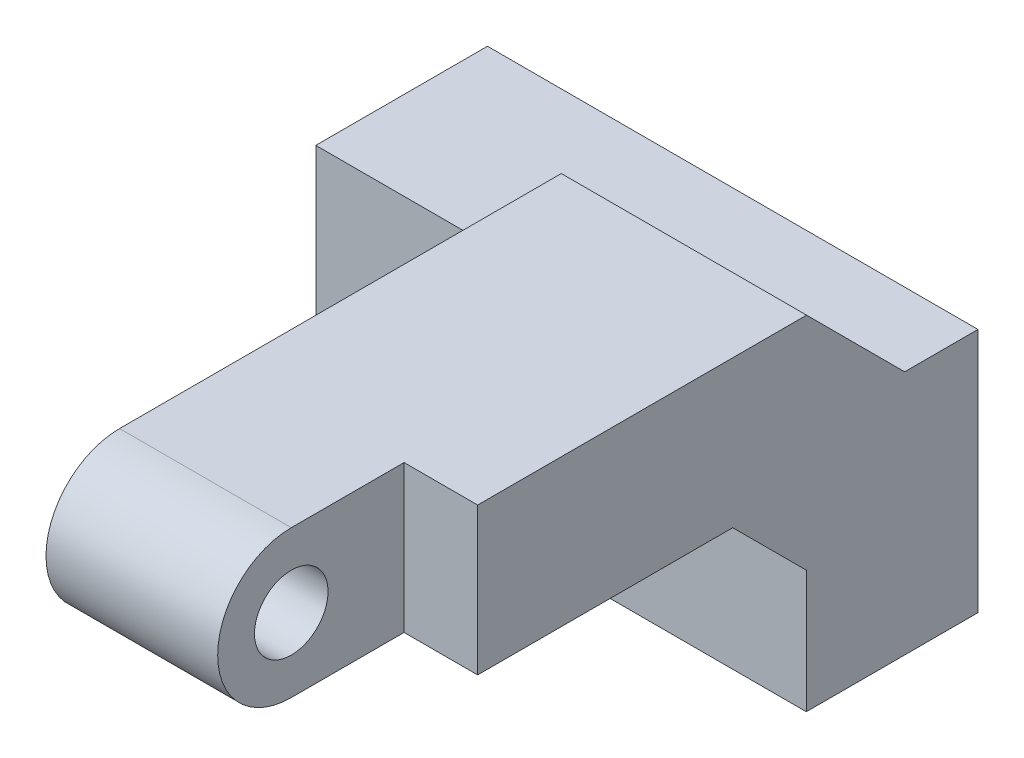
ISO-10303-21;
HEADER;
FILE_DESCRIPTION(('STEP AP214'),'2;1');
FILE_NAME('part.step','',(''),(''),'','','');
FILE_SCHEMA(('AUTOMOTIVE_DESIGN { 1 0 10303 214 1 1 1 1 }'));
ENDSEC;
DATA;
#1=APPLICATION_CONTEXT('core data for automotive mechanical design processes');
#2=APPLICATION_PROTOCOL_DEFINITION('international standard','automotive_design',2000,#1);
#3=PRODUCT_CONTEXT('',#1,'mechanical');
#4=PRODUCT('Part','Part','',(#3));
#5=PRODUCT_RELATED_PRODUCT_CATEGORY('part','',(#4));
#6=PRODUCT_DEFINITION_FORMATION('','',#4);
#7=PRODUCT_DEFINITION_CONTEXT('part definition',#1,'design');
#8=PRODUCT_DEFINITION('design','',#6,#7);
#9=PRODUCT_DEFINITION_SHAPE('','',#8);
#10=(LENGTH_UNIT() NAMED_UNIT(*) SI_UNIT(.MILLI.,.METRE.));
#11=(NAMED_UNIT(*) PLANE_ANGLE_UNIT() SI_UNIT($,.RADIAN.));
#12=(NAMED_UNIT(*) SI_UNIT($,.STERADIAN.) SOLID_ANGLE_UNIT());
#13=UNCERTAINTY_MEASURE_WITH_UNIT(LENGTH_MEASURE(1.E-05),#10,'distance_accuracy_value','');
#14=(GEOMETRIC_REPRESENTATION_CONTEXT(3) GLOBAL_UNCERTAINTY_ASSIGNED_CONTEXT((#13)) GLOBAL_UNIT_ASSIGNED_CONTEXT((#10,
#11,#12)) REPRESENTATION_CONTEXT('',''));
#15=CARTESIAN_POINT('',(0.,0.,0.));
#16=DIRECTION('',(0.,0.,1.));
#17=DIRECTION('',(1.,0.,0.));
#18=AXIS2_PLACEMENT_3D('',#15,#16,#17);
#19=CARTESIAN_POINT('',(-10.,10.,3.5));
#20=DIRECTION('',(0.,0.,-1.));
#21=DIRECTION('',(-1.,0.,0.));
#22=AXIS2_PLACEMENT_3D('',#19,#20,#21);
#23=PLANE('',#22);
#24=DIRECTION('',(-1.,0.,0.));
#25=VECTOR('',#24,1.);
#26=CARTESIAN_POINT('',(-10.,6.75,3.5));
#27=LINE('',#26,#25);
#28=CARTESIAN_POINT('',(0.,6.75,3.5));
#29=VERTEX_POINT('',#28);
#30=CARTESIAN_POINT('',(-1.58771324027147,6.75,3.5));
#31=VERTEX_POINT('',#30);
#32=EDGE_CURVE('E171',#29,#31,#27,.T.);
#33=ORIENTED_EDGE('',*,*,#32,.F.);
#34=DIRECTION('',(0.,1.,0.));
#35=VECTOR('',#34,1.);
#36=CARTESIAN_POINT('',(0.,5.,3.5));
#37=LINE('',#36,#35);
#38=CARTESIAN_POINT('',(0.,10.,3.5));
#39=VERTEX_POINT('',#38);
#40=EDGE_CURVE('E245',#29,#39,#37,.T.);
#41=ORIENTED_EDGE('',*,*,#40,.T.);
#42=DIRECTION('',(1.,0.,0.));
#43=VECTOR('',#42,1.);
#44=CARTESIAN_POINT('',(-10.,10.,3.5));
#45=LINE('',#44,#43);
#46=CARTESIAN_POINT('',(-10.,10.,3.5));
#47=VERTEX_POINT('',#46);
#48=EDGE_CURVE('E277',#47,#39,#45,.T.);
#49=ORIENTED_EDGE('',*,*,#48,.F.);
#50=DIRECTION('',(0.,-1.,0.));
#51=VECTOR('',#50,1.);
#52=CARTESIAN_POINT('',(-10.,10.,3.5));
#53=LINE('',#52,#51);
#54=CARTESIAN_POINT('',(-10.,0.,3.5));
#55=VERTEX_POINT('',#54);
#56=EDGE_CURVE('E301',#47,#55,#53,.T.);
#57=ORIENTED_EDGE('',*,*,#56,.T.);
#58=DIRECTION('',(1.,0.,0.));
#59=VECTOR('',#58,1.);
#60=CARTESIAN_POINT('',(-10.,0.,3.5));
#61=LINE('',#60,#59);
#62=CARTESIAN_POINT('',(10.,0.,3.5));
#63=VERTEX_POINT('',#62);
#64=EDGE_CURVE('E288',#55,#63,#61,.T.);
#65=ORIENTED_EDGE('',*,*,#64,.T.);
#66=DIRECTION('',(0.,-1.,0.));
#67=VECTOR('',#66,1.);
#68=CARTESIAN_POINT('',(10.,10.,3.5));
#69=LINE('',#68,#67);
#70=CARTESIAN_POINT('',(10.,5.,3.5));
#71=VERTEX_POINT('',#70);
#72=EDGE_CURVE('E299',#71,#63,#69,.T.);
#73=ORIENTED_EDGE('',*,*,#72,.F.);
#74=DIRECTION('',(-1.,0.,0.));
#75=VECTOR('',#74,1.);
#76=CARTESIAN_POINT('',(10.,5.,3.5));
#77=LINE('',#76,#75);
#78=CARTESIAN_POINT('',(2.59807621135331,5.,3.5));
#79=VERTEX_POINT('',#78);
#80=EDGE_CURVE('E270',#71,#79,#77,.T.);
#81=ORIENTED_EDGE('',*,*,#80,.T.);
#82=DIRECTION('',(-0.5,0.866025403784438,0.));
#83=VECTOR('',#82,1.);
#84=CARTESIAN_POINT('',(-2.71650635094611,14.2051270189222,3.5));
#85=LINE('',#84,#83);
#86=CARTESIAN_POINT('',(3.17542648054294,4.,3.5));
#87=VERTEX_POINT('',#86);
#88=EDGE_CURVE('E211',#87,#79,#85,.T.);
#89=ORIENTED_EDGE('',*,*,#88,.F.);
#90=DIRECTION('',(0.5,0.866025403784439,0.));
#91=VECTOR('',#90,1.);
#92=CARTESIAN_POINT('',(2.47964607176052,2.7948729810778,3.5));
#93=LINE('',#92,#91);
#94=CARTESIAN_POINT('',(1.58771324027147,1.25,3.5));
#95=VERTEX_POINT('',#94);
#96=EDGE_CURVE('E318',#95,#87,#93,.T.);
#97=ORIENTED_EDGE('',*,*,#96,.F.);
#98=DIRECTION('',(1.,0.,0.));
#99=VECTOR('',#98,1.);
#100=CARTESIAN_POINT('',(-10.,1.25,3.5));
#101=LINE('',#100,#99);
#102=CARTESIAN_POINT('',(-1.58771324027147,1.25,3.5));
#103=VERTEX_POINT('',#102);
#104=EDGE_CURVE('E320',#103,#95,#101,.T.);
#105=ORIENTED_EDGE('',*,*,#104,.F.);
#106=DIRECTION('',(0.5,-0.866025403784438,0.));
#107=VECTOR('',#106,1.);
#108=CARTESIAN_POINT('',(-7.47964607176053,11.4551270189222,3.5));
#109=LINE('',#108,#107);
#110=CARTESIAN_POINT('',(-3.17542648054294,4.,3.5));
#111=VERTEX_POINT('',#110);
#112=EDGE_CURVE('E42',#111,#103,#109,.T.);
#113=ORIENTED_EDGE('',*,*,#112,.F.);
#114=DIRECTION('',(-0.5,-0.866025403784439,0.));
#115=VECTOR('',#114,1.);
#116=CARTESIAN_POINT('',(-2.28349364905389,5.54487298107781,3.5));
#117=LINE('',#116,#115);
#118=EDGE_CURVE('E11',#31,#111,#117,.T.);
#119=ORIENTED_EDGE('',*,*,#118,.F.);
#120=EDGE_LOOP('',(#33,#41,#49,#57,#65,#73,#81,#89,#97,#105,#113,#119));
#121=FACE_BOUND('',#120,.T.);
#122=ADVANCED_FACE('F34',(#121),#23,.F.);
#123=CARTESIAN_POINT('',(10.,8.,6.50000000000004));
#124=DIRECTION('',(0.,0.707106781186551,-0.707106781186544));
#125=DIRECTION('',(0.,0.707106781186544,0.707106781186551));
#126=AXIS2_PLACEMENT_3D('',#123,#124,#125);
#127=PLANE('',#126);
#128=DIRECTION('',(-1.,0.,0.));
#129=VECTOR('',#128,1.);
#130=CARTESIAN_POINT('',(10.,6.75,5.25000000000002));
#131=LINE('',#130,#129);
#132=CARTESIAN_POINT('',(1.58771324027147,6.75,5.25000000000002));
#133=VERTEX_POINT('',#132);
#134=CARTESIAN_POINT('',(0.,6.75,5.25000000000002));
#135=VERTEX_POINT('',#134);
#136=EDGE_CURVE('E49',#133,#135,#131,.T.);
#137=ORIENTED_EDGE('',*,*,#136,.F.);
#138=DIRECTION('',(-0.377964473009226,0.654653670707974,0.654653670707981));
#139=VECTOR('',#138,1.);
#140=CARTESIAN_POINT('',(2.1708789175295,5.73992741775877,4.23992741775878));
#141=LINE('',#140,#139);
#142=EDGE_CURVE('E316',#79,#133,#141,.T.);
#143=ORIENTED_EDGE('',*,*,#142,.F.);
#144=ORIENTED_EDGE('',*,*,#80,.F.);
#145=DIRECTION('',(0.,-0.707106781186544,-0.707106781186551));
#146=VECTOR('',#145,1.);
#147=CARTESIAN_POINT('',(10.,8.,6.50000000000004));
#148=LINE('',#147,#146);
#149=CARTESIAN_POINT('',(10.,8.,6.50000000000004));
#150=VERTEX_POINT('',#149);
#151=EDGE_CURVE('E231',#150,#71,#148,.T.);
#152=ORIENTED_EDGE('',*,*,#151,.F.);
#153=DIRECTION('',(-1.,0.,0.));
#154=VECTOR('',#153,1.);
#155=CARTESIAN_POINT('',(10.,8.,6.50000000000004));
#156=LINE('',#155,#154);
#157=CARTESIAN_POINT('',(0.,8.,6.50000000000004));
#158=VERTEX_POINT('',#157);
#159=EDGE_CURVE('E242',#150,#158,#156,.T.);
#160=ORIENTED_EDGE('',*,*,#159,.T.);
#161=DIRECTION('',(0.,-0.707106781186544,-0.707106781186551));
#162=VECTOR('',#161,1.);
#163=CARTESIAN_POINT('',(0.,8.,6.50000000000004));
#164=LINE('',#163,#162);
#165=EDGE_CURVE('E230',#158,#135,#164,.T.);
#166=ORIENTED_EDGE('',*,*,#165,.T.);
#167=EDGE_LOOP('',(#137,#143,#144,#152,#160,#166));
#168=FACE_BOUND('',#167,.T.);
#169=ADVANCED_FACE('F341',(#168),#127,.F.);
#170=CARTESIAN_POINT('',(0.,11.,21.5));
#171=DIRECTION('',(1.,0.,0.));
#172=DIRECTION('',(0.,0.,-1.));
#173=AXIS2_PLACEMENT_3D('',#170,#171,#172);
#174=PLANE('',#173);
#175=CARTESIAN_POINT('',(0.,11.,21.5));
#176=DIRECTION('',(-1.,0.,0.));
#177=DIRECTION('',(0.,0.,1.));
#178=AXIS2_PLACEMENT_3D('',#175,#176,#177);
#179=CIRCLE('',#178,1.5);
#180=CARTESIAN_POINT('',(0.,11.,23.));
#181=VERTEX_POINT('',#180);
#182=EDGE_CURVE('E216',#181,#181,#179,.T.);
#183=ORIENTED_EDGE('',*,*,#182,.F.);
#184=EDGE_LOOP('',(#183));
#185=FACE_BOUND('',#184,.T.);
#186=DIRECTION('',(0.,0.,-1.));
#187=VECTOR('',#186,1.);
#188=CARTESIAN_POINT('',(0.,6.75,21.5));
#189=LINE('',#188,#187);
#190=EDGE_CURVE('E310',#135,#29,#189,.T.);
#191=ORIENTED_EDGE('',*,*,#190,.F.);
#192=ORIENTED_EDGE('',*,*,#165,.F.);
#193=DIRECTION('',(0.,0.,-1.));
#194=VECTOR('',#193,1.);
#195=CARTESIAN_POINT('',(0.,8.,6.50000000000004));
#196=LINE('',#195,#194);
#197=CARTESIAN_POINT('',(0.,8.,21.5));
#198=VERTEX_POINT('',#197);
#199=EDGE_CURVE('E235',#198,#158,#196,.T.);
#200=ORIENTED_EDGE('',*,*,#199,.F.);
#201=CARTESIAN_POINT('',(0.,11.,21.5));
#202=DIRECTION('',(1.,0.,0.));
#203=DIRECTION('',(0.,0.,-1.));
#204=AXIS2_PLACEMENT_3D('',#201,#202,#203);
#205=CIRCLE('',#204,3.);
#206=CARTESIAN_POINT('',(0.,14.,21.5));
#207=VERTEX_POINT('',#206);
#208=EDGE_CURVE('E254',#207,#198,#205,.T.);
#209=ORIENTED_EDGE('',*,*,#208,.F.);
#210=DIRECTION('',(0.,0.,1.));
#211=VECTOR('',#210,1.);
#212=CARTESIAN_POINT('',(0.,14.,21.5));
#213=LINE('',#212,#211);
#214=CARTESIAN_POINT('',(0.,14.,3.48969735514617));
#215=VERTEX_POINT('',#214);
#216=EDGE_CURVE('E251',#215,#207,#213,.T.);
#217=ORIENTED_EDGE('',*,*,#216,.F.);
#218=DIRECTION('',(0.,0.707106781186544,0.707106781186551));
#219=VECTOR('',#218,1.);
#220=CARTESIAN_POINT('',(0.,10.,-0.510302644853876));
#221=LINE('',#220,#219);
#222=CARTESIAN_POINT('',(0.,10.,-0.510302644853876));
#223=VERTEX_POINT('',#222);
#224=EDGE_CURVE('E249',#223,#215,#221,.T.);
#225=ORIENTED_EDGE('',*,*,#224,.F.);
#226=DIRECTION('',(0.,0.,-1.));
#227=VECTOR('',#226,1.);
#228=CARTESIAN_POINT('',(0.,10.,3.5));
#229=LINE('',#228,#227);
#230=EDGE_CURVE('E247',#39,#223,#229,.T.);
#231=ORIENTED_EDGE('',*,*,#230,.F.);
#232=ORIENTED_EDGE('',*,*,#40,.F.);
#233=EDGE_LOOP('',(#191,#192,#200,#209,#217,#225,#231,#232));
#234=FACE_BOUND('',#233,.T.);
#235=ADVANCED_FACE('F348',(#185,#234),#174,.F.);
#236=CARTESIAN_POINT('',(0.,4.,-3.5));
#237=DIRECTION('',(0.,0.,1.));
#238=DIRECTION('',(1.,0.,0.));
#239=AXIS2_PLACEMENT_3D('',#236,#237,#238);
#240=CYLINDRICAL_SURFACE('',#239,1.5);
#241=CARTESIAN_POINT('',(0.,4.,-3.5));
#242=DIRECTION('',(0.,0.,1.));
#243=DIRECTION('',(1.,0.,0.));
#244=AXIS2_PLACEMENT_3D('',#241,#242,#243);
#245=CIRCLE('',#244,1.5);
#246=CARTESIAN_POINT('',(1.5,4.,-3.5));
#247=VERTEX_POINT('',#246);
#248=EDGE_CURVE('E213',#247,#247,#245,.T.);
#249=ORIENTED_EDGE('',*,*,#248,.F.);
#250=EDGE_LOOP('',(#249));
#251=FACE_BOUND('',#250,.T.);
#252=CARTESIAN_POINT('',(0.,4.,0.));
#253=DIRECTION('',(0.,0.,1.));
#254=DIRECTION('',(1.,0.,0.));
#255=AXIS2_PLACEMENT_3D('',#252,#253,#254);
#256=CIRCLE('',#255,1.5);
#257=CARTESIAN_POINT('',(1.5,4.,0.));
#258=VERTEX_POINT('',#257);
#259=EDGE_CURVE('E174',#258,#258,#256,.F.);
#260=ORIENTED_EDGE('',*,*,#259,.F.);
#261=EDGE_LOOP('',(#260));
#262=FACE_BOUND('',#261,.T.);
#263=ADVANCED_FACE('F418',(#251,#262),#240,.F.);
#264=CARTESIAN_POINT('',(0.,10.,0.));
#265=DIRECTION('',(0.,-1.,0.));
#266=DIRECTION('',(0.,0.,-1.));
#267=AXIS2_PLACEMENT_3D('',#264,#265,#266);
#268=PLANE('',#267);
#269=DIRECTION('',(-1.,0.,0.));
#270=VECTOR('',#269,1.);
#271=CARTESIAN_POINT('',(10.,10.,-0.510302644853876));
#272=LINE('',#271,#270);
#273=CARTESIAN_POINT('',(10.,10.,-0.510302644853875));
#274=VERTEX_POINT('',#273);
#275=EDGE_CURVE('E267',#274,#223,#272,.T.);
#276=ORIENTED_EDGE('',*,*,#275,.F.);
#277=DIRECTION('',(0.,0.,-1.));
#278=VECTOR('',#277,1.);
#279=CARTESIAN_POINT('',(10.,10.,3.5));
#280=LINE('',#279,#278);
#281=CARTESIAN_POINT('',(10.,10.,-3.5));
#282=VERTEX_POINT('',#281);
#283=EDGE_CURVE('E281',#274,#282,#280,.T.);
#284=ORIENTED_EDGE('',*,*,#283,.T.);
#285=DIRECTION('',(-1.,0.,0.));
#286=VECTOR('',#285,1.);
#287=CARTESIAN_POINT('',(-10.,10.,-3.5));
#288=LINE('',#287,#286);
#289=CARTESIAN_POINT('',(-10.,10.,-3.5));
#290=VERTEX_POINT('',#289);
#291=EDGE_CURVE('E283',#282,#290,#288,.T.);
#292=ORIENTED_EDGE('',*,*,#291,.T.);
#293=DIRECTION('',(0.,0.,1.));
#294=VECTOR('',#293,1.);
#295=CARTESIAN_POINT('',(-10.,10.,3.5));
#296=LINE('',#295,#294);
#297=EDGE_CURVE('E274',#290,#47,#296,.T.);
#298=ORIENTED_EDGE('',*,*,#297,.T.);
#299=ORIENTED_EDGE('',*,*,#48,.T.);
#300=ORIENTED_EDGE('',*,*,#230,.T.);
#301=EDGE_LOOP('',(#276,#284,#292,#298,#299,#300));
#302=FACE_BOUND('',#301,.T.);
#303=ADVANCED_FACE('F353',(#302),#268,.F.);
#304=CARTESIAN_POINT('',(-10.,10.,3.5));
#305=DIRECTION('',(1.,0.,0.));
#306=DIRECTION('',(0.,0.,-1.));
#307=AXIS2_PLACEMENT_3D('',#304,#305,#306);
#308=PLANE('',#307);
#309=DIRECTION('',(0.,0.,1.));
#310=VECTOR('',#309,1.);
#311=CARTESIAN_POINT('',(-10.,0.,3.5));
#312=LINE('',#311,#310);
#313=CARTESIAN_POINT('',(-10.,0.,-3.5));
#314=VERTEX_POINT('',#313);
#315=EDGE_CURVE('E273',#314,#55,#312,.T.);
#316=ORIENTED_EDGE('',*,*,#315,.T.);
#317=ORIENTED_EDGE('',*,*,#56,.F.);
#318=ORIENTED_EDGE('',*,*,#297,.F.);
#319=DIRECTION('',(0.,-1.,0.));
#320=VECTOR('',#319,1.);
#321=CARTESIAN_POINT('',(-10.,10.,-3.5));
#322=LINE('',#321,#320);
#323=EDGE_CURVE('E285',#290,#314,#322,.T.);
#324=ORIENTED_EDGE('',*,*,#323,.T.);
#325=EDGE_LOOP('',(#316,#317,#318,#324));
#326=FACE_BOUND('',#325,.T.);
#327=ADVANCED_FACE('F36',(#326),#308,.F.);
#328=CARTESIAN_POINT('',(10.,10.,3.5));
#329=DIRECTION('',(-1.,0.,0.));
#330=DIRECTION('',(0.,0.,1.));
#331=AXIS2_PLACEMENT_3D('',#328,#329,#330);
#332=PLANE('',#331);
#333=DIRECTION('',(0.,0.,1.));
#334=VECTOR('',#333,1.);
#335=CARTESIAN_POINT('',(10.,14.,21.5));
#336=LINE('',#335,#334);
#337=CARTESIAN_POINT('',(10.,14.,3.48969735514617));
#338=VERTEX_POINT('',#337);
#339=CARTESIAN_POINT('',(10.,14.,16.9));
#340=VERTEX_POINT('',#339);
#341=EDGE_CURVE('E237',#338,#340,#336,.T.);
#342=ORIENTED_EDGE('',*,*,#341,.T.);
#343=DIRECTION('',(0.,1.,0.));
#344=VECTOR('',#343,1.);
#345=CARTESIAN_POINT('',(10.,0.,16.9));
#346=LINE('',#345,#344);
#347=CARTESIAN_POINT('',(10.,8.,16.9));
#348=VERTEX_POINT('',#347);
#349=EDGE_CURVE('E224',#348,#340,#346,.T.);
#350=ORIENTED_EDGE('',*,*,#349,.F.);
#351=DIRECTION('',(0.,0.,-1.));
#352=VECTOR('',#351,1.);
#353=CARTESIAN_POINT('',(10.,8.,6.50000000000004));
#354=LINE('',#353,#352);
#355=EDGE_CURVE('E240',#348,#150,#354,.T.);
#356=ORIENTED_EDGE('',*,*,#355,.T.);
#357=ORIENTED_EDGE('',*,*,#151,.T.);
#358=ORIENTED_EDGE('',*,*,#72,.T.);
#359=DIRECTION('',(0.,0.,-1.));
#360=VECTOR('',#359,1.);
#361=CARTESIAN_POINT('',(10.,0.,3.5));
#362=LINE('',#361,#360);
#363=CARTESIAN_POINT('',(10.,0.,-3.5));
#364=VERTEX_POINT('',#363);
#365=EDGE_CURVE('E291',#63,#364,#362,.T.);
#366=ORIENTED_EDGE('',*,*,#365,.T.);
#367=DIRECTION('',(0.,-1.,0.));
#368=VECTOR('',#367,1.);
#369=CARTESIAN_POINT('',(10.,10.,-3.5));
#370=LINE('',#369,#368);
#371=EDGE_CURVE('E296',#282,#364,#370,.T.);
#372=ORIENTED_EDGE('',*,*,#371,.F.);
#373=ORIENTED_EDGE('',*,*,#283,.F.);
#374=DIRECTION('',(0.,0.707106781186544,0.707106781186551));
#375=VECTOR('',#374,1.);
#376=CARTESIAN_POINT('',(10.,10.,-0.510302644853876));
#377=LINE('',#376,#375);
#378=EDGE_CURVE('E234',#274,#338,#377,.T.);
#379=ORIENTED_EDGE('',*,*,#378,.T.);
#380=EDGE_LOOP('',(#342,#350,#356,#357,#358,#366,#372,#373,#379));
#381=FACE_BOUND('',#380,.T.);
#382=ADVANCED_FACE('F370',(#381),#332,.F.);
#383=CARTESIAN_POINT('',(-10.,10.,-3.5));
#384=DIRECTION('',(0.,0.,1.));
#385=DIRECTION('',(1.,0.,0.));
#386=AXIS2_PLACEMENT_3D('',#383,#384,#385);
#387=PLANE('',#386);
#388=ORIENTED_EDGE('',*,*,#248,.T.);
#389=EDGE_LOOP('',(#388));
#390=FACE_BOUND('',#389,.T.);
#391=DIRECTION('',(-1.,0.,0.));
#392=VECTOR('',#391,1.);
#393=CARTESIAN_POINT('',(-10.,0.,-3.5));
#394=LINE('',#393,#392);
#395=EDGE_CURVE('E278',#364,#314,#394,.T.);
#396=ORIENTED_EDGE('',*,*,#395,.T.);
#397=ORIENTED_EDGE('',*,*,#323,.F.);
#398=ORIENTED_EDGE('',*,*,#291,.F.);
#399=ORIENTED_EDGE('',*,*,#371,.T.);
#400=EDGE_LOOP('',(#396,#397,#398,#399));
#401=FACE_BOUND('',#400,.T.);
#402=ADVANCED_FACE('F377',(#390,#401),#387,.F.);
#403=CARTESIAN_POINT('',(0.,0.,0.));
#404=DIRECTION('',(0.,-1.,0.));
#405=DIRECTION('',(0.,0.,-1.));
#406=AXIS2_PLACEMENT_3D('',#403,#404,#405);
#407=PLANE('',#406);
#408=ORIENTED_EDGE('',*,*,#315,.F.);
#409=ORIENTED_EDGE('',*,*,#395,.F.);
#410=ORIENTED_EDGE('',*,*,#365,.F.);
#411=ORIENTED_EDGE('',*,*,#64,.F.);
#412=EDGE_LOOP('',(#408,#409,#410,#411));
#413=FACE_BOUND('',#412,.T.);
#414=ADVANCED_FACE('F383',(#413),#407,.T.);
#415=CARTESIAN_POINT('',(10.,10.,-0.510302644853876));
#416=DIRECTION('',(0.,-0.707106781186551,0.707106781186544));
#417=DIRECTION('',(0.,-0.707106781186544,-0.707106781186551));
#418=AXIS2_PLACEMENT_3D('',#415,#416,#417);
#419=PLANE('',#418);
#420=ORIENTED_EDGE('',*,*,#224,.T.);
#421=DIRECTION('',(-1.,0.,0.));
#422=VECTOR('',#421,1.);
#423=CARTESIAN_POINT('',(10.,14.,3.48969735514617));
#424=LINE('',#423,#422);
#425=EDGE_CURVE('E264',#338,#215,#424,.T.);
#426=ORIENTED_EDGE('',*,*,#425,.F.);
#427=ORIENTED_EDGE('',*,*,#378,.F.);
#428=ORIENTED_EDGE('',*,*,#275,.T.);
#429=EDGE_LOOP('',(#420,#426,#427,#428));
#430=FACE_BOUND('',#429,.T.);
#431=ADVANCED_FACE('F360',(#430),#419,.F.);
#432=CARTESIAN_POINT('',(10.,14.,21.5));
#433=DIRECTION('',(0.,-1.,0.));
#434=DIRECTION('',(0.,0.,-1.));
#435=AXIS2_PLACEMENT_3D('',#432,#433,#434);
#436=PLANE('',#435);
#437=DIRECTION('',(-1.,0.,0.));
#438=VECTOR('',#437,1.);
#439=CARTESIAN_POINT('',(10.,14.,21.5));
#440=LINE('',#439,#438);
#441=CARTESIAN_POINT('',(7.,14.,21.5));
#442=VERTEX_POINT('',#441);
#443=EDGE_CURVE('E262',#442,#207,#440,.T.);
#444=ORIENTED_EDGE('',*,*,#443,.F.);
#445=DIRECTION('',(0.,0.,1.));
#446=VECTOR('',#445,1.);
#447=CARTESIAN_POINT('',(7.,14.,26.1));
#448=LINE('',#447,#446);
#449=CARTESIAN_POINT('',(7.,14.,16.9));
#450=VERTEX_POINT('',#449);
#451=EDGE_CURVE('E222',#450,#442,#448,.T.);
#452=ORIENTED_EDGE('',*,*,#451,.F.);
#453=DIRECTION('',(-1.,0.,0.));
#454=VECTOR('',#453,1.);
#455=CARTESIAN_POINT('',(10.,14.,16.9));
#456=LINE('',#455,#454);
#457=EDGE_CURVE('E220',#340,#450,#456,.T.);
#458=ORIENTED_EDGE('',*,*,#457,.F.);
#459=ORIENTED_EDGE('',*,*,#341,.F.);
#460=ORIENTED_EDGE('',*,*,#425,.T.);
#461=ORIENTED_EDGE('',*,*,#216,.T.);
#462=EDGE_LOOP('',(#444,#452,#458,#459,#460,#461));
#463=FACE_BOUND('',#462,.T.);
#464=ADVANCED_FACE('F365',(#463),#436,.F.);
#465=CARTESIAN_POINT('',(10.,11.,21.5));
#466=DIRECTION('',(-1.,0.,0.));
#467=DIRECTION('',(0.,0.,1.));
#468=AXIS2_PLACEMENT_3D('',#465,#466,#467);
#469=CYLINDRICAL_SURFACE('',#468,3.);
#470=DIRECTION('',(-1.,0.,0.));
#471=VECTOR('',#470,1.);
#472=CARTESIAN_POINT('',(10.,8.,21.5));
#473=LINE('',#472,#471);
#474=CARTESIAN_POINT('',(7.,8.,21.5));
#475=VERTEX_POINT('',#474);
#476=EDGE_CURVE('E260',#475,#198,#473,.T.);
#477=ORIENTED_EDGE('',*,*,#476,.F.);
#478=CARTESIAN_POINT('',(7.,11.,21.5));
#479=DIRECTION('',(-1.,0.,0.));
#480=DIRECTION('',(0.,0.,1.));
#481=AXIS2_PLACEMENT_3D('',#478,#479,#480);
#482=CIRCLE('',#481,3.);
#483=EDGE_CURVE('E226',#475,#442,#482,.T.);
#484=ORIENTED_EDGE('',*,*,#483,.T.);
#485=ORIENTED_EDGE('',*,*,#443,.T.);
#486=ORIENTED_EDGE('',*,*,#208,.T.);
#487=EDGE_LOOP('',(#477,#484,#485,#486));
#488=FACE_BOUND('',#487,.T.);
#489=ADVANCED_FACE('F388',(#488),#469,.T.);
#490=CARTESIAN_POINT('',(10.,8.,6.50000000000004));
#491=DIRECTION('',(0.,1.,0.));
#492=DIRECTION('',(0.,0.,1.));
#493=AXIS2_PLACEMENT_3D('',#490,#491,#492);
#494=PLANE('',#493);
#495=DIRECTION('',(-1.,0.,0.));
#496=VECTOR('',#495,1.);
#497=CARTESIAN_POINT('',(10.,8.,16.9));
#498=LINE('',#497,#496);
#499=CARTESIAN_POINT('',(7.,8.,16.9));
#500=VERTEX_POINT('',#499);
#501=EDGE_CURVE('E304',#348,#500,#498,.T.);
#502=ORIENTED_EDGE('',*,*,#501,.T.);
#503=DIRECTION('',(0.,0.,1.));
#504=VECTOR('',#503,1.);
#505=CARTESIAN_POINT('',(7.,8.,6.50000000000004));
#506=LINE('',#505,#504);
#507=EDGE_CURVE('E307',#500,#475,#506,.T.);
#508=ORIENTED_EDGE('',*,*,#507,.T.);
#509=ORIENTED_EDGE('',*,*,#476,.T.);
#510=ORIENTED_EDGE('',*,*,#199,.T.);
#511=ORIENTED_EDGE('',*,*,#159,.F.);
#512=ORIENTED_EDGE('',*,*,#355,.F.);
#513=EDGE_LOOP('',(#502,#508,#509,#510,#511,#512));
#514=FACE_BOUND('',#513,.T.);
#515=ADVANCED_FACE('F385',(#514),#494,.F.);
#516=CARTESIAN_POINT('',(7.,0.,26.1));
#517=DIRECTION('',(-1.,0.,0.));
#518=DIRECTION('',(0.,0.,1.));
#519=AXIS2_PLACEMENT_3D('',#516,#517,#518);
#520=PLANE('',#519);
#521=CARTESIAN_POINT('',(7.,11.,21.5));
#522=DIRECTION('',(-1.,0.,0.));
#523=DIRECTION('',(0.,0.,1.));
#524=AXIS2_PLACEMENT_3D('',#521,#522,#523);
#525=CIRCLE('',#524,1.5);
#526=CARTESIAN_POINT('',(7.,11.,23.));
#527=VERTEX_POINT('',#526);
#528=EDGE_CURVE('E219',#527,#527,#525,.T.);
#529=ORIENTED_EDGE('',*,*,#528,.T.);
#530=EDGE_LOOP('',(#529));
#531=FACE_BOUND('',#530,.T.);
#532=ORIENTED_EDGE('',*,*,#507,.F.);
#533=DIRECTION('',(0.,1.,0.));
#534=VECTOR('',#533,1.);
#535=CARTESIAN_POINT('',(7.,0.,16.9));
#536=LINE('',#535,#534);
#537=EDGE_CURVE('E57',#500,#450,#536,.T.);
#538=ORIENTED_EDGE('',*,*,#537,.T.);
#539=ORIENTED_EDGE('',*,*,#451,.T.);
#540=ORIENTED_EDGE('',*,*,#483,.F.);
#541=EDGE_LOOP('',(#532,#538,#539,#540));
#542=FACE_BOUND('',#541,.T.);
#543=ADVANCED_FACE('F390',(#531,#542),#520,.F.);
#544=CARTESIAN_POINT('',(10.,0.,16.9));
#545=DIRECTION('',(0.,0.,-1.));
#546=DIRECTION('',(-1.,0.,0.));
#547=AXIS2_PLACEMENT_3D('',#544,#545,#546);
#548=PLANE('',#547);
#549=ORIENTED_EDGE('',*,*,#349,.T.);
#550=ORIENTED_EDGE('',*,*,#457,.T.);
#551=ORIENTED_EDGE('',*,*,#537,.F.);
#552=ORIENTED_EDGE('',*,*,#501,.F.);
#553=EDGE_LOOP('',(#549,#550,#551,#552));
#554=FACE_BOUND('',#553,.T.);
#555=ADVANCED_FACE('F391',(#554),#548,.F.);
#556=CARTESIAN_POINT('',(10.,11.,21.5));
#557=DIRECTION('',(-1.,0.,0.));
#558=DIRECTION('',(0.,0.,1.));
#559=AXIS2_PLACEMENT_3D('',#556,#557,#558);
#560=CYLINDRICAL_SURFACE('',#559,1.5);
#561=ORIENTED_EDGE('',*,*,#182,.T.);
#562=EDGE_LOOP('',(#561));
#563=FACE_BOUND('',#562,.T.);
#564=ORIENTED_EDGE('',*,*,#528,.F.);
#565=EDGE_LOOP('',(#564));
#566=FACE_BOUND('',#565,.T.);
#567=ADVANCED_FACE('F393',(#563,#566),#560,.F.);
#568=CARTESIAN_POINT('',(-1.58771324027147,6.75,24.5));
#569=DIRECTION('',(0.866025403784439,-0.5,0.));
#570=DIRECTION('',(0.5,0.866025403784439,0.));
#571=AXIS2_PLACEMENT_3D('',#568,#569,#570);
#572=PLANE('',#571);
#573=ORIENTED_EDGE('',*,*,#118,.T.);
#574=DIRECTION('',(0.,0.,-1.));
#575=VECTOR('',#574,1.);
#576=CARTESIAN_POINT('',(-3.17542648054294,4.,24.5));
#577=LINE('',#576,#575);
#578=CARTESIAN_POINT('',(-3.17542648054294,4.,0.));
#579=VERTEX_POINT('',#578);
#580=EDGE_CURVE('E175',#111,#579,#577,.T.);
#581=ORIENTED_EDGE('',*,*,#580,.T.);
#582=DIRECTION('',(-0.5,-0.866025403784439,0.));
#583=VECTOR('',#582,1.);
#584=CARTESIAN_POINT('',(-1.58771324027147,6.75,0.));
#585=LINE('',#584,#583);
#586=CARTESIAN_POINT('',(-1.58771324027147,6.75,0.));
#587=VERTEX_POINT('',#586);
#588=EDGE_CURVE('E178',#587,#579,#585,.T.);
#589=ORIENTED_EDGE('',*,*,#588,.F.);
#590=DIRECTION('',(0.,0.,-1.));
#591=VECTOR('',#590,1.);
#592=CARTESIAN_POINT('',(-1.58771324027147,6.75,24.5));
#593=LINE('',#592,#591);
#594=EDGE_CURVE('E164',#31,#587,#593,.T.);
#595=ORIENTED_EDGE('',*,*,#594,.F.);
#596=EDGE_LOOP('',(#573,#581,#589,#595));
#597=FACE_BOUND('',#596,.T.);
#598=ADVANCED_FACE('F179',(#597),#572,.T.);
#599=CARTESIAN_POINT('',(-3.17542648054294,4.,24.5));
#600=DIRECTION('',(0.866025403784438,0.5,0.));
#601=DIRECTION('',(-0.5,0.866025403784438,0.));
#602=AXIS2_PLACEMENT_3D('',#599,#600,#601);
#603=PLANE('',#602);
#604=ORIENTED_EDGE('',*,*,#112,.T.);
#605=DIRECTION('',(0.,0.,-1.));
#606=VECTOR('',#605,1.);
#607=CARTESIAN_POINT('',(-1.58771324027147,1.25,24.5));
#608=LINE('',#607,#606);
#609=CARTESIAN_POINT('',(-1.58771324027147,1.25,0.));
#610=VERTEX_POINT('',#609);
#611=EDGE_CURVE('E206',#103,#610,#608,.T.);
#612=ORIENTED_EDGE('',*,*,#611,.T.);
#613=DIRECTION('',(0.5,-0.866025403784438,0.));
#614=VECTOR('',#613,1.);
#615=CARTESIAN_POINT('',(-3.17542648054294,4.,0.));
#616=LINE('',#615,#614);
#617=EDGE_CURVE('E184',#579,#610,#616,.T.);
#618=ORIENTED_EDGE('',*,*,#617,.F.);
#619=ORIENTED_EDGE('',*,*,#580,.F.);
#620=EDGE_LOOP('',(#604,#612,#618,#619));
#621=FACE_BOUND('',#620,.T.);
#622=ADVANCED_FACE('F324',(#621),#603,.T.);
#623=CARTESIAN_POINT('',(-1.58771324027147,1.25,24.5));
#624=DIRECTION('',(0.,1.,0.));
#625=DIRECTION('',(-1.,0.,0.));
#626=AXIS2_PLACEMENT_3D('',#623,#624,#625);
#627=PLANE('',#626);
#628=ORIENTED_EDGE('',*,*,#104,.T.);
#629=DIRECTION('',(0.,0.,-1.));
#630=VECTOR('',#629,1.);
#631=CARTESIAN_POINT('',(1.58771324027147,1.25,24.5));
#632=LINE('',#631,#630);
#633=CARTESIAN_POINT('',(1.58771324027147,1.25,0.));
#634=VERTEX_POINT('',#633);
#635=EDGE_CURVE('E204',#95,#634,#632,.T.);
#636=ORIENTED_EDGE('',*,*,#635,.T.);
#637=DIRECTION('',(1.,0.,0.));
#638=VECTOR('',#637,1.);
#639=CARTESIAN_POINT('',(-1.58771324027147,1.25,0.));
#640=LINE('',#639,#638);
#641=EDGE_CURVE('E194',#610,#634,#640,.T.);
#642=ORIENTED_EDGE('',*,*,#641,.F.);
#643=ORIENTED_EDGE('',*,*,#611,.F.);
#644=EDGE_LOOP('',(#628,#636,#642,#643));
#645=FACE_BOUND('',#644,.T.);
#646=ADVANCED_FACE('F329',(#645),#627,.T.);
#647=CARTESIAN_POINT('',(1.58771324027147,1.25,24.5));
#648=DIRECTION('',(-0.866025403784438,0.5,0.));
#649=DIRECTION('',(-0.5,-0.866025403784439,0.));
#650=AXIS2_PLACEMENT_3D('',#647,#648,#649);
#651=PLANE('',#650);
#652=ORIENTED_EDGE('',*,*,#96,.T.);
#653=DIRECTION('',(0.,0.,-1.));
#654=VECTOR('',#653,1.);
#655=CARTESIAN_POINT('',(3.17542648054294,4.,24.5));
#656=LINE('',#655,#654);
#657=CARTESIAN_POINT('',(3.17542648054294,4.,0.));
#658=VERTEX_POINT('',#657);
#659=EDGE_CURVE('E202',#87,#658,#656,.T.);
#660=ORIENTED_EDGE('',*,*,#659,.T.);
#661=DIRECTION('',(0.5,0.866025403784439,0.));
#662=VECTOR('',#661,1.);
#663=CARTESIAN_POINT('',(1.58771324027147,1.25,0.));
#664=LINE('',#663,#662);
#665=EDGE_CURVE('E197',#634,#658,#664,.T.);
#666=ORIENTED_EDGE('',*,*,#665,.F.);
#667=ORIENTED_EDGE('',*,*,#635,.F.);
#668=EDGE_LOOP('',(#652,#660,#666,#667));
#669=FACE_BOUND('',#668,.T.);
#670=ADVANCED_FACE('F335',(#669),#651,.T.);
#671=CARTESIAN_POINT('',(3.17542648054294,4.,24.5));
#672=DIRECTION('',(-0.866025403784438,-0.5,0.));
#673=DIRECTION('',(0.5,-0.866025403784438,0.));
#674=AXIS2_PLACEMENT_3D('',#671,#672,#673);
#675=PLANE('',#674);
#676=ORIENTED_EDGE('',*,*,#88,.T.);
#677=ORIENTED_EDGE('',*,*,#142,.T.);
#678=DIRECTION('',(0.,0.,-1.));
#679=VECTOR('',#678,1.);
#680=CARTESIAN_POINT('',(1.58771324027147,6.75,24.5));
#681=LINE('',#680,#679);
#682=CARTESIAN_POINT('',(1.58771324027147,6.75,0.));
#683=VERTEX_POINT('',#682);
#684=EDGE_CURVE('E200',#133,#683,#681,.T.);
#685=ORIENTED_EDGE('',*,*,#684,.T.);
#686=DIRECTION('',(-0.5,0.866025403784438,0.));
#687=VECTOR('',#686,1.);
#688=CARTESIAN_POINT('',(3.17542648054294,4.,0.));
#689=LINE('',#688,#687);
#690=EDGE_CURVE('E190',#658,#683,#689,.T.);
#691=ORIENTED_EDGE('',*,*,#690,.F.);
#692=ORIENTED_EDGE('',*,*,#659,.F.);
#693=EDGE_LOOP('',(#676,#677,#685,#691,#692));
#694=FACE_BOUND('',#693,.T.);
#695=ADVANCED_FACE('F338',(#694),#675,.T.);
#696=CARTESIAN_POINT('',(1.58771324027147,6.75,24.5));
#697=DIRECTION('',(0.,-1.,0.));
#698=DIRECTION('',(1.,0.,0.));
#699=AXIS2_PLACEMENT_3D('',#696,#697,#698);
#700=PLANE('',#699);
#701=ORIENTED_EDGE('',*,*,#32,.T.);
#702=ORIENTED_EDGE('',*,*,#594,.T.);
#703=DIRECTION('',(-1.,0.,0.));
#704=VECTOR('',#703,1.);
#705=CARTESIAN_POINT('',(1.58771324027147,6.75,0.));
#706=LINE('',#705,#704);
#707=EDGE_CURVE('E168',#683,#587,#706,.T.);
#708=ORIENTED_EDGE('',*,*,#707,.F.);
#709=ORIENTED_EDGE('',*,*,#684,.F.);
#710=ORIENTED_EDGE('',*,*,#136,.T.);
#711=ORIENTED_EDGE('',*,*,#190,.T.);
#712=EDGE_LOOP('',(#701,#702,#708,#709,#710,#711));
#713=FACE_BOUND('',#712,.T.);
#714=ADVANCED_FACE('F166',(#713),#700,.T.);
#715=CARTESIAN_POINT('',(0.,0.,0.));
#716=DIRECTION('',(0.,0.,1.));
#717=DIRECTION('',(1.,0.,0.));
#718=AXIS2_PLACEMENT_3D('',#715,#716,#717);
#719=PLANE('',#718);
#720=ORIENTED_EDGE('',*,*,#707,.T.);
#721=ORIENTED_EDGE('',*,*,#588,.T.);
#722=ORIENTED_EDGE('',*,*,#617,.T.);
#723=ORIENTED_EDGE('',*,*,#641,.T.);
#724=ORIENTED_EDGE('',*,*,#665,.T.);
#725=ORIENTED_EDGE('',*,*,#690,.T.);
#726=EDGE_LOOP('',(#720,#721,#722,#723,#724,#725));
#727=FACE_BOUND('',#726,.T.);
#728=ORIENTED_EDGE('',*,*,#259,.T.);
#729=EDGE_LOOP('',(#728));
#730=FACE_BOUND('',#729,.T.);
#731=ADVANCED_FACE('F186',(#727,#730),#719,.T.);
#732=CLOSED_SHELL('',(#122,#169,#235,#263,#303,#327,#382,#402,#414,#431,#464,#489,#515,#543,
#555,#567,#598,#622,#646,#670,#695,#714,#731));
#733=MANIFOLD_SOLID_BREP('B2',#732);
#734=ADVANCED_BREP_SHAPE_REPRESENTATION('',(#18,#733),#14);
#735=SHAPE_DEFINITION_REPRESENTATION(#9,#734);
ENDSEC;
END-ISO-10303-21;
